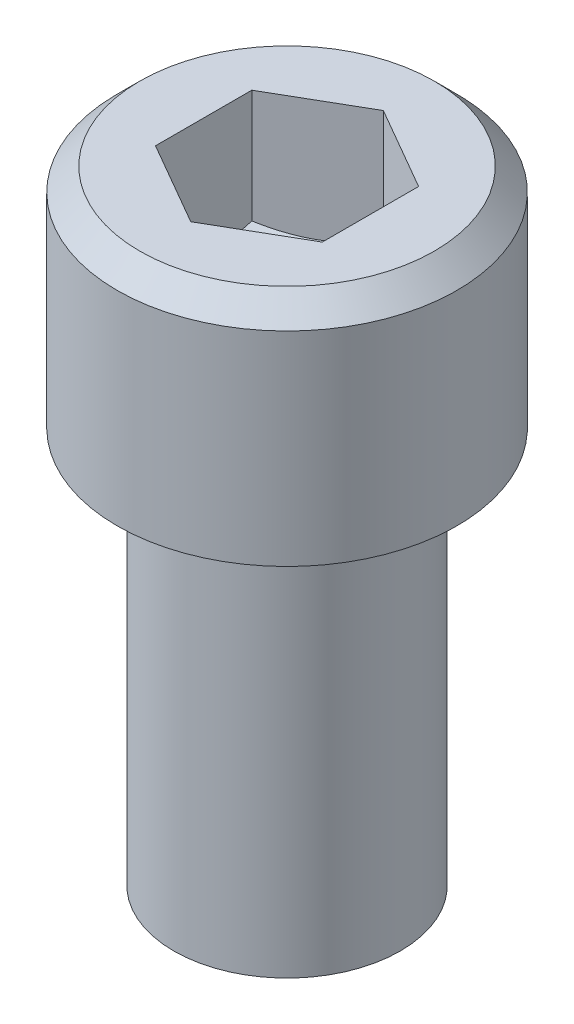
ISO-10303-21;
HEADER;
FILE_DESCRIPTION(('STEP AP214'),'2;1');
FILE_NAME('part.step','',(''),(''),'','','');
FILE_SCHEMA(('AUTOMOTIVE_DESIGN { 1 0 10303 214 1 1 1 1 }'));
ENDSEC;
DATA;
#1=APPLICATION_CONTEXT('core data for automotive mechanical design processes');
#2=APPLICATION_PROTOCOL_DEFINITION('international standard','automotive_design',2000,#1);
#3=PRODUCT_CONTEXT('',#1,'mechanical');
#4=PRODUCT('Part','Part','',(#3));
#5=PRODUCT_RELATED_PRODUCT_CATEGORY('part','',(#4));
#6=PRODUCT_DEFINITION_FORMATION('','',#4);
#7=PRODUCT_DEFINITION_CONTEXT('part definition',#1,'design');
#8=PRODUCT_DEFINITION('design','',#6,#7);
#9=PRODUCT_DEFINITION_SHAPE('','',#8);
#10=(LENGTH_UNIT() NAMED_UNIT(*) SI_UNIT(.MILLI.,.METRE.));
#11=(NAMED_UNIT(*) PLANE_ANGLE_UNIT() SI_UNIT($,.RADIAN.));
#12=(NAMED_UNIT(*) SI_UNIT($,.STERADIAN.) SOLID_ANGLE_UNIT());
#13=UNCERTAINTY_MEASURE_WITH_UNIT(LENGTH_MEASURE(1.E-05),#10,'distance_accuracy_value','');
#14=(GEOMETRIC_REPRESENTATION_CONTEXT(3) GLOBAL_UNCERTAINTY_ASSIGNED_CONTEXT((#13)) GLOBAL_UNIT_ASSIGNED_CONTEXT((#10,
#11,#12)) REPRESENTATION_CONTEXT('',''));
#15=CARTESIAN_POINT('',(0.,0.,0.));
#16=DIRECTION('',(0.,0.,1.));
#17=DIRECTION('',(1.,0.,0.));
#18=AXIS2_PLACEMENT_3D('',#15,#16,#17);
#19=CARTESIAN_POINT('',(0.,0.,0.));
#20=DIRECTION('',(0.,1.,0.));
#21=DIRECTION('',(0.,0.,1.));
#22=AXIS2_PLACEMENT_3D('',#19,#20,#21);
#23=PLANE('',#22);
#24=CARTESIAN_POINT('',(0.,0.,0.));
#25=DIRECTION('',(0.,1.,0.));
#26=DIRECTION('',(0.,0.,1.));
#27=AXIS2_PLACEMENT_3D('',#24,#25,#26);
#28=CIRCLE('',#27,15.);
#29=CARTESIAN_POINT('',(0.,0.,15.));
#30=VERTEX_POINT('',#29);
#31=EDGE_CURVE('E193',#30,#30,#28,.T.);
#32=ORIENTED_EDGE('',*,*,#31,.F.);
#33=EDGE_LOOP('',(#32));
#34=FACE_BOUND('',#33,.T.);
#35=CARTESIAN_POINT('',(0.,0.,0.));
#36=DIRECTION('',(0.,1.,0.));
#37=DIRECTION('',(0.,0.,1.));
#38=AXIS2_PLACEMENT_3D('',#35,#36,#37);
#39=CIRCLE('',#38,10.);
#40=CARTESIAN_POINT('',(0.,0.,10.));
#41=VERTEX_POINT('',#40);
#42=EDGE_CURVE('E11',#41,#41,#39,.F.);
#43=ORIENTED_EDGE('',*,*,#42,.F.);
#44=EDGE_LOOP('',(#43));
#45=FACE_BOUND('',#44,.T.);
#46=ADVANCED_FACE('F33',(#34,#45),#23,.F.);
#47=CARTESIAN_POINT('',(0.,20.,0.));
#48=DIRECTION('',(0.,1.,0.));
#49=DIRECTION('',(0.,0.,1.));
#50=AXIS2_PLACEMENT_3D('',#47,#48,#49);
#51=PLANE('',#50);
#52=CARTESIAN_POINT('',(0.,20.,0.));
#53=DIRECTION('',(0.,1.,0.));
#54=DIRECTION('',(0.,0.,1.));
#55=AXIS2_PLACEMENT_3D('',#52,#53,#54);
#56=CIRCLE('',#55,13.);
#57=CARTESIAN_POINT('',(0.,20.,13.));
#58=VERTEX_POINT('',#57);
#59=EDGE_CURVE('E106',#58,#58,#56,.T.);
#60=ORIENTED_EDGE('',*,*,#59,.T.);
#61=EDGE_LOOP('',(#60));
#62=FACE_BOUND('',#61,.T.);
#63=DIRECTION('',(-0.866025403784439,0.,0.5));
#64=VECTOR('',#63,1.);
#65=CARTESIAN_POINT('',(0.,20.,-8.5));
#66=LINE('',#65,#64);
#67=CARTESIAN_POINT('',(0.,20.,-8.5));
#68=VERTEX_POINT('',#67);
#69=CARTESIAN_POINT('',(-7.36121593216773,20.,-4.25));
#70=VERTEX_POINT('',#69);
#71=EDGE_CURVE('E169',#68,#70,#66,.T.);
#72=ORIENTED_EDGE('',*,*,#71,.F.);
#73=DIRECTION('',(-0.866025403784439,0.,-0.5));
#74=VECTOR('',#73,1.);
#75=CARTESIAN_POINT('',(7.36121593216773,20.,-4.25));
#76=LINE('',#75,#74);
#77=CARTESIAN_POINT('',(7.36121593216773,20.,-4.25));
#78=VERTEX_POINT('',#77);
#79=EDGE_CURVE('E167',#78,#68,#76,.T.);
#80=ORIENTED_EDGE('',*,*,#79,.F.);
#81=DIRECTION('',(0.,0.,-1.));
#82=VECTOR('',#81,1.);
#83=CARTESIAN_POINT('',(7.36121593216773,20.,4.25));
#84=LINE('',#83,#82);
#85=CARTESIAN_POINT('',(7.36121593216773,20.,4.25));
#86=VERTEX_POINT('',#85);
#87=EDGE_CURVE('E178',#86,#78,#84,.T.);
#88=ORIENTED_EDGE('',*,*,#87,.F.);
#89=DIRECTION('',(0.866025403784439,0.,-0.5));
#90=VECTOR('',#89,1.);
#91=CARTESIAN_POINT('',(0.,20.,8.5));
#92=LINE('',#91,#90);
#93=CARTESIAN_POINT('',(0.,20.,8.5));
#94=VERTEX_POINT('',#93);
#95=EDGE_CURVE('E175',#94,#86,#92,.T.);
#96=ORIENTED_EDGE('',*,*,#95,.F.);
#97=DIRECTION('',(0.866025403784439,0.,0.5));
#98=VECTOR('',#97,1.);
#99=CARTESIAN_POINT('',(-7.36121593216773,20.,4.25));
#100=LINE('',#99,#98);
#101=CARTESIAN_POINT('',(-7.36121593216773,20.,4.25));
#102=VERTEX_POINT('',#101);
#103=EDGE_CURVE('E173',#102,#94,#100,.T.);
#104=ORIENTED_EDGE('',*,*,#103,.F.);
#105=DIRECTION('',(0.,0.,1.));
#106=VECTOR('',#105,1.);
#107=CARTESIAN_POINT('',(-7.36121593216773,20.,-4.25));
#108=LINE('',#107,#106);
#109=EDGE_CURVE('E171',#70,#102,#108,.T.);
#110=ORIENTED_EDGE('',*,*,#109,.F.);
#111=EDGE_LOOP('',(#72,#80,#88,#96,#104,#110));
#112=FACE_BOUND('',#111,.T.);
#113=ADVANCED_FACE('F161',(#62,#112),#51,.T.);
#114=CARTESIAN_POINT('',(0.,20.,0.));
#115=DIRECTION('',(0.,-1.,0.));
#116=DIRECTION('',(0.,0.,-1.));
#117=AXIS2_PLACEMENT_3D('',#114,#115,#116);
#118=CYLINDRICAL_SURFACE('',#117,15.);
#119=CARTESIAN_POINT('',(0.,18.,0.));
#120=DIRECTION('',(0.,1.,0.));
#121=DIRECTION('',(0.,0.,1.));
#122=AXIS2_PLACEMENT_3D('',#119,#120,#121);
#123=CIRCLE('',#122,15.);
#124=CARTESIAN_POINT('',(0.,18.,15.));
#125=VERTEX_POINT('',#124);
#126=EDGE_CURVE('E104',#125,#125,#123,.F.);
#127=ORIENTED_EDGE('',*,*,#126,.T.);
#128=EDGE_LOOP('',(#127));
#129=FACE_BOUND('',#128,.T.);
#130=ORIENTED_EDGE('',*,*,#31,.T.);
#131=EDGE_LOOP('',(#130));
#132=FACE_BOUND('',#131,.T.);
#133=ADVANCED_FACE('F159',(#129,#132),#118,.T.);
#134=CARTESIAN_POINT('',(7.36121593216773,20.,-4.25));
#135=DIRECTION('',(-0.5,0.,0.866025403784439));
#136=DIRECTION('',(0.866025403784439,0.,0.5));
#137=AXIS2_PLACEMENT_3D('',#134,#135,#136);
#138=PLANE('',#137);
#139=CARTESIAN_POINT('',(7.36141593216773,10.0000666680251,-4.24988452994616));
#140=CARTESIAN_POINT('',(7.19960818175587,9.94613895952467,-4.34330427820342));
#141=CARTESIAN_POINT('',(7.03719713388849,9.89465870137131,-4.43707234040902));
#142=CARTESIAN_POINT('',(6.7110560874949,9.79726716089987,-4.62536996133815));
#143=CARTESIAN_POINT('',(6.54732555222756,9.75135828096166,-4.71989982994931));
#144=CARTESIAN_POINT('',(6.05351243049603,9.62288983377227,-5.00500296871037));
#145=CARTESIAN_POINT('',(5.72148060044795,9.54981848380212,-5.19670163516816));
#146=CARTESIAN_POINT('',(5.22460101081872,9.46413377999269,-5.48357519999542));
#147=CARTESIAN_POINT('',(5.06123786339596,9.43972470107806,-5.57789295713562));
#148=CARTESIAN_POINT('',(4.73377342364453,9.39879426611522,-5.76695463957614));
#149=CARTESIAN_POINT('',(4.56967219782834,9.38227221314881,-5.86169852647546));
#150=CARTESIAN_POINT('',(4.24118474388598,9.35753689940043,-6.0513508464345));
#151=CARTESIAN_POINT('',(4.07679905224546,9.34931420919841,-6.14625896975407));
#152=CARTESIAN_POINT('',(3.74788490137995,9.34134511518765,-6.33615764329655));
#153=CARTESIAN_POINT('',(3.58335644672258,9.34159844951695,-6.43114819088234));
#154=CARTESIAN_POINT('',(3.13260428390249,9.3539432482886,-6.69139007342433));
#155=CARTESIAN_POINT('',(2.84652813349521,9.37466619161034,-6.8565562158707));
#156=CARTESIAN_POINT('',(2.2762759224993,9.44037826228818,-7.18579148339516));
#157=CARTESIAN_POINT('',(1.9921018673287,9.48538984865689,-7.34985945064462));
#158=CARTESIAN_POINT('',(1.4207020681992,9.59790553348465,-7.67975727848693));
#159=CARTESIAN_POINT('',(1.13354842244687,9.66588633917057,-7.84554551316082));
#160=CARTESIAN_POINT('',(0.563523350558411,9.82017525452583,-8.17464964186046));
#161=CARTESIAN_POINT('',(0.280644624544245,9.90644712344439,-8.33796975047276));
#162=CARTESIAN_POINT('',(-0.000200000000001161,10.0000666680251,-8.50011547005384));
#163=B_SPLINE_CURVE_WITH_KNOTS('',3,(#139,#140,#141,#142,#143,#144,#145,#146,#147,#148,#149,
#150,#151,#152,#153,#154,#155,#156,#157,#158,#159,#160,#161,#162),.UNSPECIFIED.,.F.,.F.,(4,2,2,
2,2,2,2,2,2,2,2,4),(0.,0.583352725260263,1.16695610529089,2.33658787289725,2.90707928832208,
3.47752028430155,4.0473124348964,4.61708698210426,5.60899117781515,6.60181413455886,
7.61665629949857,8.62950620385062),.UNSPECIFIED.);
#164=CARTESIAN_POINT('',(7.36121593216773,10.,-4.25));
#165=VERTEX_POINT('',#164);
#166=CARTESIAN_POINT('',(0.,10.,-8.5));
#167=VERTEX_POINT('',#166);
#168=EDGE_CURVE('E99',#165,#167,#163,.T.);
#169=ORIENTED_EDGE('',*,*,#168,.F.);
#170=DIRECTION('',(0.,-1.,0.));
#171=VECTOR('',#170,1.);
#172=CARTESIAN_POINT('',(7.36121593216773,20.,-4.25));
#173=LINE('',#172,#171);
#174=EDGE_CURVE('E180',#78,#165,#173,.T.);
#175=ORIENTED_EDGE('',*,*,#174,.F.);
#176=ORIENTED_EDGE('',*,*,#79,.T.);
#177=DIRECTION('',(0.,-1.,0.));
#178=VECTOR('',#177,1.);
#179=CARTESIAN_POINT('',(0.,20.,-8.5));
#180=LINE('',#179,#178);
#181=EDGE_CURVE('E191',#68,#167,#180,.T.);
#182=ORIENTED_EDGE('',*,*,#181,.T.);
#183=EDGE_LOOP('',(#169,#175,#176,#182));
#184=FACE_BOUND('',#183,.T.);
#185=ADVANCED_FACE('F155',(#184),#138,.T.);
#186=CARTESIAN_POINT('',(0.,20.,-8.5));
#187=DIRECTION('',(0.5,0.,0.866025403784439));
#188=DIRECTION('',(0.866025403784439,0.,-0.5));
#189=AXIS2_PLACEMENT_3D('',#186,#187,#188);
#190=PLANE('',#189);
#191=CARTESIAN_POINT('',(0.000199999999999696,10.0000666680251,-8.50011547005384));
#192=CARTESIAN_POINT('',(-0.161607750411857,9.94613895952467,-8.40669572179659));
#193=CARTESIAN_POINT('',(-0.32401879827924,9.89465870137131,-8.31292765959098));
#194=CARTESIAN_POINT('',(-0.650159844672832,9.79726716089987,-8.12463003866186));
#195=CARTESIAN_POINT('',(-0.813890379940173,9.75135828096166,-8.0301001700507));
#196=CARTESIAN_POINT('',(-1.3077035016717,9.62288983377227,-7.74499703128963));
#197=CARTESIAN_POINT('',(-1.63973533171978,9.54981848380212,-7.55329836483185));
#198=CARTESIAN_POINT('',(-2.13661492134901,9.46413377999269,-7.26642480000458));
#199=CARTESIAN_POINT('',(-2.29997806877177,9.43972470107806,-7.17210704286438));
#200=CARTESIAN_POINT('',(-2.6274425085232,9.39879426611522,-6.98304536042386));
#201=CARTESIAN_POINT('',(-2.79154373433938,9.38227221314881,-6.88830147352454));
#202=CARTESIAN_POINT('',(-3.12003118828175,9.35753689940043,-6.6986491535655));
#203=CARTESIAN_POINT('',(-3.28441687992227,9.34931420919841,-6.60374103024593));
#204=CARTESIAN_POINT('',(-3.61333103078778,9.34134511518765,-6.41384235670345));
#205=CARTESIAN_POINT('',(-3.77785948544515,9.34159844951695,-6.31885180911766));
#206=CARTESIAN_POINT('',(-4.22861164826524,9.3539432482886,-6.05860992657568));
#207=CARTESIAN_POINT('',(-4.51468779867251,9.37466619161034,-5.89344378412931));
#208=CARTESIAN_POINT('',(-5.08494000966843,9.44037826228818,-5.56420851660484));
#209=CARTESIAN_POINT('',(-5.36911406483903,9.48538984865689,-5.40014054935538));
#210=CARTESIAN_POINT('',(-5.94051386396853,9.59790553348465,-5.07024272151307));
#211=CARTESIAN_POINT('',(-6.22766750972086,9.66588633917057,-4.90445448683918));
#212=CARTESIAN_POINT('',(-6.79769258160932,9.82017525452583,-4.57535035813954));
#213=CARTESIAN_POINT('',(-7.08057130762348,9.90644712344439,-4.41203024952724));
#214=CARTESIAN_POINT('',(-7.36141593216773,10.0000666680251,-4.24988452994616));
#215=B_SPLINE_CURVE_WITH_KNOTS('',3,(#191,#192,#193,#194,#195,#196,#197,#198,#199,#200,#201,
#202,#203,#204,#205,#206,#207,#208,#209,#210,#211,#212,#213,#214),.UNSPECIFIED.,.F.,.F.,(4,2,2,
2,2,2,2,2,2,2,2,4),(0.,0.583352725260262,1.16695610529089,2.33658787289725,2.90707928832208,
3.47752028430155,4.0473124348964,4.61708698210426,5.60899117781515,6.60181413455886,
7.61665629949857,8.62950620385062),.UNSPECIFIED.);
#216=CARTESIAN_POINT('',(-7.36121593216773,10.,-4.25));
#217=VERTEX_POINT('',#216);
#218=EDGE_CURVE('E48',#167,#217,#215,.T.);
#219=ORIENTED_EDGE('',*,*,#218,.F.);
#220=ORIENTED_EDGE('',*,*,#181,.F.);
#221=ORIENTED_EDGE('',*,*,#71,.T.);
#222=DIRECTION('',(0.,-1.,0.));
#223=VECTOR('',#222,1.);
#224=CARTESIAN_POINT('',(-7.36121593216773,20.,-4.25));
#225=LINE('',#224,#223);
#226=EDGE_CURVE('E189',#70,#217,#225,.T.);
#227=ORIENTED_EDGE('',*,*,#226,.T.);
#228=EDGE_LOOP('',(#219,#220,#221,#227));
#229=FACE_BOUND('',#228,.T.);
#230=ADVANCED_FACE('F151',(#229),#190,.T.);
#231=CARTESIAN_POINT('',(-7.36121593216773,20.,-4.25));
#232=DIRECTION('',(1.,0.,0.));
#233=DIRECTION('',(0.,0.,-1.));
#234=AXIS2_PLACEMENT_3D('',#231,#232,#233);
#235=PLANE('',#234);
#236=CARTESIAN_POINT('',(-7.36121593216773,12.7371598535109,-11.0060860927594));
#237=CARTESIAN_POINT('',(-7.36121593216773,12.5846517830262,-10.6882034280636));
#238=CARTESIAN_POINT('',(-7.36121593216773,12.4337277821218,-10.3695463655895));
#239=CARTESIAN_POINT('',(-7.36121593216773,12.1359465436057,-9.73027070249291));
#240=CARTESIAN_POINT('',(-7.36121593216773,11.9890900377323,-9.40965176143511));
#241=CARTESIAN_POINT('',(-7.36121593216773,11.6995219860401,-8.76420124102433));
#242=CARTESIAN_POINT('',(-7.36121593216773,11.5568409875494,-8.43935590540438));
#243=CARTESIAN_POINT('',(-7.36121593216773,11.27787714956,-7.78693939772008));
#244=CARTESIAN_POINT('',(-7.36121593216773,11.1415939775906,-7.45936836834347));
#245=CARTESIAN_POINT('',(-7.36121593216773,10.8736591831411,-6.79235029959029));
#246=CARTESIAN_POINT('',(-7.36121593216773,10.742221818657,-6.4528166804155));
#247=CARTESIAN_POINT('',(-7.36121593216773,10.4902747786098,-5.76964347702385));
#248=CARTESIAN_POINT('',(-7.36121593216773,10.3697663695335,-5.42600342214731));
#249=CARTESIAN_POINT('',(-7.36121593216773,10.1431190263413,-4.73484477176889));
#250=CARTESIAN_POINT('',(-7.36121593216773,10.03694746816,-4.38733699853979));
#251=CARTESIAN_POINT('',(-7.36121593216773,9.84261749280186,-3.68738449506551));
#252=CARTESIAN_POINT('',(-7.36121593216773,9.75445302146668,-3.33494146682685));
#253=CARTESIAN_POINT('',(-7.36121593216773,9.60083056620083,-2.62574688108735));
#254=CARTESIAN_POINT('',(-7.36121593216773,9.53532692802668,-2.26900550261343));
#255=CARTESIAN_POINT('',(-7.36121593216773,9.45729002570221,-1.73098289849675));
#256=CARTESIAN_POINT('',(-7.36121593216773,9.43464637180266,-1.55114084836175));
#257=CARTESIAN_POINT('',(-7.36121593216773,9.39654857590444,-1.19070246894475));
#258=CARTESIAN_POINT('',(-7.36121593216773,9.38109375540148,-1.01010621247111));
#259=CARTESIAN_POINT('',(-7.36121593216773,9.35785661505417,-0.650578586619515));
#260=CARTESIAN_POINT('',(-7.36121593216773,9.34998513713767,-0.471652995143195));
#261=CARTESIAN_POINT('',(-7.36121593216773,9.34177442851608,-0.113630248199395));
#262=CARTESIAN_POINT('',(-7.36121593216773,9.34143508513,0.0654669046614378));
#263=CARTESIAN_POINT('',(-7.36121593216773,9.34829749090963,0.423522536669169));
#264=CARTESIAN_POINT('',(-7.36121593216773,9.3554994909768,0.602481011003973));
#265=CARTESIAN_POINT('',(-7.36121593216773,9.37727848245017,0.959951458975741));
#266=CARTESIAN_POINT('',(-7.36121593216773,9.39185588580012,1.13846340711282));
#267=CARTESIAN_POINT('',(-7.36121593216773,9.43672824002924,1.57985478595483));
#268=CARTESIAN_POINT('',(-7.36121593216773,9.47120462808069,1.84231558142463));
#269=CARTESIAN_POINT('',(-7.36121593216773,9.55412187585899,2.36502428556028));
#270=CARTESIAN_POINT('',(-7.36121593216773,9.60256497816221,2.62527183194002));
#271=CARTESIAN_POINT('',(-7.36121593216773,9.71169176289983,3.14339334369931));
#272=CARTESIAN_POINT('',(-7.36121593216773,9.77238577140595,3.40126511355961));
#273=CARTESIAN_POINT('',(-7.36121593216773,9.90419106439866,3.91430086834253));
#274=CARTESIAN_POINT('',(-7.36121593216773,9.97530209385418,4.16946491939195));
#275=CARTESIAN_POINT('',(-7.36121593216773,10.1279707859107,4.68286426301545));
#276=CARTESIAN_POINT('',(-7.36121593216773,10.2097269328074,4.94104013545649));
#277=CARTESIAN_POINT('',(-7.36121593216773,10.3808377219459,5.45484806131504));
#278=CARTESIAN_POINT('',(-7.36121593216773,10.4701924187331,5.71048009645721));
#279=CARTESIAN_POINT('',(-7.36121593216773,10.6551564928607,6.2193447708992));
#280=CARTESIAN_POINT('',(-7.36121593216773,10.7507633418746,6.47257833327323));
#281=CARTESIAN_POINT('',(-7.36121593216773,10.9471909395647,6.97700199843276));
#282=CARTESIAN_POINT('',(-7.36121593216773,11.0480116022434,7.22819213484377));
#283=CARTESIAN_POINT('',(-7.36121593216773,11.3118303695482,7.86938611194774));
#284=CARTESIAN_POINT('',(-7.36121593216773,11.4779431421433,8.25810718157448));
#285=CARTESIAN_POINT('',(-7.36121593216773,11.8181592959437,9.0320474760509));
#286=CARTESIAN_POINT('',(-7.36121593216773,11.9922632792978,9.41726643438278));
#287=CARTESIAN_POINT('',(-7.36121593216773,12.3466657505692,10.1849595462372));
#288=CARTESIAN_POINT('',(-7.36121593216772,12.5269658586937,10.5674329497361));
#289=CARTESIAN_POINT('',(-7.36121593216772,12.8923641012256,11.3300617925132));
#290=CARTESIAN_POINT('',(-7.36121593216772,13.0774621046556,11.7102172947185));
#291=CARTESIAN_POINT('',(-7.36121593216772,13.4516911109892,12.4691040054739));
#292=CARTESIAN_POINT('',(-7.36121593216772,13.6408267029194,12.8478329470405));
#293=CARTESIAN_POINT('',(-7.36121593216772,14.0221657852851,13.6037435799026));
#294=CARTESIAN_POINT('',(-7.36121593216772,14.2143692928253,13.9809252625567));
#295=CARTESIAN_POINT('',(-7.36121593216772,14.6012419210547,14.7339479738573));
#296=CARTESIAN_POINT('',(-7.36121593216772,14.7959106611148,15.1097891982561));
#297=CARTESIAN_POINT('',(-7.36121593216772,15.187304765345,15.8603997964074));
#298=CARTESIAN_POINT('',(-7.36121593216772,15.3840301362629,16.2351691666379));
#299=CARTESIAN_POINT('',(-7.36121593216772,15.9394626441247,17.287469091883));
#300=CARTESIAN_POINT('',(-7.36121593216772,16.3001104773351,17.9639751578056));
#301=CARTESIAN_POINT('',(-7.36121593216772,17.0255079271171,19.3148171188177));
#302=CARTESIAN_POINT('',(-7.36121593216772,17.3902577176417,19.9891529203005));
#303=CARTESIAN_POINT('',(-7.36121593216772,18.1219066318219,21.3344342721722));
#304=CARTESIAN_POINT('',(-7.36121593216772,18.4887979288144,22.0053840831206));
#305=CARTESIAN_POINT('',(-7.36121593216772,19.2249664765955,23.3459235766608));
#306=CARTESIAN_POINT('',(-7.36121593216772,19.5942435884088,24.0155133355428));
#307=CARTESIAN_POINT('',(-7.36121593216772,19.964395148617,24.6846160456873));
#308=B_SPLINE_CURVE_WITH_KNOTS('',3,(#236,#237,#238,#239,#240,#241,#242,#243,#244,#245,#246,
#247,#248,#249,#250,#251,#252,#253,#254,#255,#256,#257,#258,#259,#260,#261,#262,#263,#264,#265,
#266,#267,#268,#269,#270,#271,#272,#273,#274,#275,#276,#277,#278,#279,#280,#281,#282,#283,#284,
#285,#286,#287,#288,#289,#290,#291,#292,#293,#294,#295,#296,#297,#298,#299,#300,#301,#302,#303,
#304,#305,#306,#307),.UNSPECIFIED.,.F.,.F.,(4,2,2,2,2,2,2,2,2,2,2,2,2,2,2,2,2,2,2,2,2,2,2,2,2,2,
2,2,2,2,2,2,2,2,2,4),(0.,1.0577356376546,2.11566034100395,3.18000245417199,4.24428919615383,
5.3364024635684,6.42864212772349,7.51835289624393,8.60769668808471,9.69483284616079,
10.238497449304,10.7821107292859,11.3192517462844,11.8563847276297,12.3935355800267,
12.9307164376123,13.7244153039608,14.5182416822291,15.3127399779307,16.1072188258564,
16.9195115528273,17.7318101112404,18.5437821892325,19.3557408787185,20.6237892796655,
21.8919333871759,23.1604116597279,24.428855340555,25.6988267991184,26.9688053408026,
28.2385901337958,29.5083790942402,31.8082586568396,34.1082361217754,36.4023635222985,
38.6963584719053),.UNSPECIFIED.);
#309=CARTESIAN_POINT('',(-7.36121593216773,10.,4.25));
#310=VERTEX_POINT('',#309);
#311=EDGE_CURVE('E56',#217,#310,#308,.T.);
#312=ORIENTED_EDGE('',*,*,#311,.F.);
#313=ORIENTED_EDGE('',*,*,#226,.F.);
#314=ORIENTED_EDGE('',*,*,#109,.T.);
#315=DIRECTION('',(0.,-1.,0.));
#316=VECTOR('',#315,1.);
#317=CARTESIAN_POINT('',(-7.36121593216773,20.,4.25));
#318=LINE('',#317,#316);
#319=EDGE_CURVE('E187',#102,#310,#318,.T.);
#320=ORIENTED_EDGE('',*,*,#319,.T.);
#321=EDGE_LOOP('',(#312,#313,#314,#320));
#322=FACE_BOUND('',#321,.T.);
#323=ADVANCED_FACE('F148',(#322),#235,.T.);
#324=CARTESIAN_POINT('',(-7.36121593216773,20.,4.25));
#325=DIRECTION('',(0.5,0.,-0.866025403784439));
#326=DIRECTION('',(-0.866025403784439,0.,-0.5));
#327=AXIS2_PLACEMENT_3D('',#324,#325,#326);
#328=PLANE('',#327);
#329=CARTESIAN_POINT('',(-7.36141593216773,10.0000666680251,4.24988452994616));
#330=CARTESIAN_POINT('',(-7.19960818175587,9.94613895952467,4.34330427820342));
#331=CARTESIAN_POINT('',(-7.03719713388849,9.8946587013713,4.43707234040902));
#332=CARTESIAN_POINT('',(-6.71105608749489,9.79726716089987,4.62536996133815));
#333=CARTESIAN_POINT('',(-6.54732555222755,9.75135828096166,4.71989982994931));
#334=CARTESIAN_POINT('',(-6.05351243049602,9.62288983377227,5.00500296871037));
#335=CARTESIAN_POINT('',(-5.72148060044795,9.54981848380212,5.19670163516816));
#336=CARTESIAN_POINT('',(-5.22460101081872,9.46413377999269,5.48357519999542));
#337=CARTESIAN_POINT('',(-5.06123786339596,9.43972470107806,5.57789295713562));
#338=CARTESIAN_POINT('',(-4.73377342364452,9.39879426611521,5.76695463957614));
#339=CARTESIAN_POINT('',(-4.56967219782834,9.38227221314881,5.86169852647546));
#340=CARTESIAN_POINT('',(-4.24118474388598,9.35753689940043,6.0513508464345));
#341=CARTESIAN_POINT('',(-4.07679905224546,9.34931420919841,6.14625896975407));
#342=CARTESIAN_POINT('',(-3.74788490137995,9.34134511518765,6.33615764329655));
#343=CARTESIAN_POINT('',(-3.58335644672258,9.34159844951695,6.43114819088234));
#344=CARTESIAN_POINT('',(-3.13260428390249,9.3539432482886,6.69139007342433));
#345=CARTESIAN_POINT('',(-2.84652813349521,9.37466619161034,6.8565562158707));
#346=CARTESIAN_POINT('',(-2.2762759224993,9.44037826228818,7.18579148339516));
#347=CARTESIAN_POINT('',(-1.9921018673287,9.48538984865689,7.34985945064462));
#348=CARTESIAN_POINT('',(-1.4207020681992,9.59790553348465,7.67975727848693));
#349=CARTESIAN_POINT('',(-1.13354842244687,9.66588633917057,7.84554551316082));
#350=CARTESIAN_POINT('',(-0.563523350558411,9.82017525452583,8.17464964186046));
#351=CARTESIAN_POINT('',(-0.280644624544245,9.90644712344439,8.33796975047276));
#352=CARTESIAN_POINT('',(0.000200000000001375,10.0000666680251,8.50011547005384));
#353=B_SPLINE_CURVE_WITH_KNOTS('',3,(#329,#330,#331,#332,#333,#334,#335,#336,#337,#338,#339,
#340,#341,#342,#343,#344,#345,#346,#347,#348,#349,#350,#351,#352),.UNSPECIFIED.,.F.,.F.,(4,2,2,
2,2,2,2,2,2,2,2,4),(0.,0.583352725260264,1.16695610529089,2.33658787289725,2.90707928832208,
3.47752028430155,4.0473124348964,4.61708698210426,5.60899117781515,6.60181413455886,
7.61665629949857,8.62950620385062),.UNSPECIFIED.);
#354=CARTESIAN_POINT('',(0.,10.,8.5));
#355=VERTEX_POINT('',#354);
#356=EDGE_CURVE('E133',#310,#355,#353,.T.);
#357=ORIENTED_EDGE('',*,*,#356,.F.);
#358=ORIENTED_EDGE('',*,*,#319,.F.);
#359=ORIENTED_EDGE('',*,*,#103,.T.);
#360=DIRECTION('',(0.,-1.,0.));
#361=VECTOR('',#360,1.);
#362=CARTESIAN_POINT('',(0.,20.,8.5));
#363=LINE('',#362,#361);
#364=EDGE_CURVE('E184',#94,#355,#363,.T.);
#365=ORIENTED_EDGE('',*,*,#364,.T.);
#366=EDGE_LOOP('',(#357,#358,#359,#365));
#367=FACE_BOUND('',#366,.T.);
#368=ADVANCED_FACE('F123',(#367),#328,.T.);
#369=CARTESIAN_POINT('',(0.,20.,8.5));
#370=DIRECTION('',(-0.5,0.,-0.866025403784439));
#371=DIRECTION('',(-0.866025403784439,0.,0.5));
#372=AXIS2_PLACEMENT_3D('',#369,#370,#371);
#373=PLANE('',#372);
#374=CARTESIAN_POINT('',(-0.000200000000000077,10.0000666680251,8.50011547005384));
#375=CARTESIAN_POINT('',(0.161607750411857,9.94613895952467,8.40669572179659));
#376=CARTESIAN_POINT('',(0.32401879827924,9.89465870137131,8.31292765959098));
#377=CARTESIAN_POINT('',(0.650159844672831,9.79726716089987,8.12463003866186));
#378=CARTESIAN_POINT('',(0.813890379940172,9.75135828096166,8.0301001700507));
#379=CARTESIAN_POINT('',(1.3077035016717,9.62288983377227,7.74499703128963));
#380=CARTESIAN_POINT('',(1.63973533171978,9.54981848380212,7.55329836483185));
#381=CARTESIAN_POINT('',(2.13661492134901,9.46413377999269,7.26642480000458));
#382=CARTESIAN_POINT('',(2.29997806877177,9.43972470107806,7.17210704286438));
#383=CARTESIAN_POINT('',(2.6274425085232,9.39879426611522,6.98304536042386));
#384=CARTESIAN_POINT('',(2.79154373433938,9.38227221314881,6.88830147352454));
#385=CARTESIAN_POINT('',(3.12003118828175,9.35753689940043,6.6986491535655));
#386=CARTESIAN_POINT('',(3.28441687992227,9.34931420919841,6.60374103024593));
#387=CARTESIAN_POINT('',(3.61333103078778,9.34134511518765,6.41384235670345));
#388=CARTESIAN_POINT('',(3.77785948544515,9.34159844951695,6.31885180911766));
#389=CARTESIAN_POINT('',(4.22861164826524,9.3539432482886,6.05860992657568));
#390=CARTESIAN_POINT('',(4.51468779867251,9.37466619161034,5.89344378412931));
#391=CARTESIAN_POINT('',(5.08494000966843,9.44037826228818,5.56420851660484));
#392=CARTESIAN_POINT('',(5.36911406483903,9.48538984865689,5.40014054935538));
#393=CARTESIAN_POINT('',(5.94051386396853,9.59790553348465,5.07024272151307));
#394=CARTESIAN_POINT('',(6.22766750972086,9.66588633917057,4.90445448683918));
#395=CARTESIAN_POINT('',(6.79769258160932,9.82017525452583,4.57535035813954));
#396=CARTESIAN_POINT('',(7.08057130762348,9.90644712344439,4.41203024952724));
#397=CARTESIAN_POINT('',(7.36141593216773,10.0000666680251,4.24988452994616));
#398=B_SPLINE_CURVE_WITH_KNOTS('',3,(#374,#375,#376,#377,#378,#379,#380,#381,#382,#383,#384,
#385,#386,#387,#388,#389,#390,#391,#392,#393,#394,#395,#396,#397),.UNSPECIFIED.,.F.,.F.,(4,2,2,
2,2,2,2,2,2,2,2,4),(0.,0.583352725260262,1.16695610529089,2.33658787289725,2.90707928832208,
3.47752028430155,4.0473124348964,4.61708698210426,5.60899117781515,6.60181413455886,
7.61665629949858,8.62950620385062),.UNSPECIFIED.);
#399=CARTESIAN_POINT('',(7.36121593216773,10.,4.25));
#400=VERTEX_POINT('',#399);
#401=EDGE_CURVE('E101',#355,#400,#398,.T.);
#402=ORIENTED_EDGE('',*,*,#401,.F.);
#403=ORIENTED_EDGE('',*,*,#364,.F.);
#404=ORIENTED_EDGE('',*,*,#95,.T.);
#405=DIRECTION('',(0.,-1.,0.));
#406=VECTOR('',#405,1.);
#407=CARTESIAN_POINT('',(7.36121593216773,20.,4.25));
#408=LINE('',#407,#406);
#409=EDGE_CURVE('E182',#86,#400,#408,.T.);
#410=ORIENTED_EDGE('',*,*,#409,.T.);
#411=EDGE_LOOP('',(#402,#403,#404,#410));
#412=FACE_BOUND('',#411,.T.);
#413=ADVANCED_FACE('F119',(#412),#373,.T.);
#414=CARTESIAN_POINT('',(7.36121593216773,20.,4.25));
#415=DIRECTION('',(-1.,0.,0.));
#416=DIRECTION('',(0.,0.,1.));
#417=AXIS2_PLACEMENT_3D('',#414,#415,#416);
#418=PLANE('',#417);
#419=CARTESIAN_POINT('',(7.36121593216773,12.7371598516111,-11.0060860888009));
#420=CARTESIAN_POINT('',(7.36121593216773,12.5846517812083,-10.6882034242403));
#421=CARTESIAN_POINT('',(7.36121593216773,12.4337277803857,-10.3695463619015));
#422=CARTESIAN_POINT('',(7.36121593216773,12.1359465420327,-9.73027069907626));
#423=CARTESIAN_POINT('',(7.36121593216773,11.9890900362406,-9.40965175815434));
#424=CARTESIAN_POINT('',(7.36121593216773,11.6995219847113,-8.76420123801791));
#425=CARTESIAN_POINT('',(7.36121593216773,11.5568409863019,-8.43935590253643));
#426=CARTESIAN_POINT('',(7.36121593216773,11.2778771484738,-7.78693939513018));
#427=CARTESIAN_POINT('',(7.36121593216773,11.1415939765843,-7.45936836589313));
#428=CARTESIAN_POINT('',(7.36121593216773,10.8736591822949,-6.7923502974272));
#429=CARTESIAN_POINT('',(7.36121593216773,10.742221817891,-6.45281667840017));
#430=CARTESIAN_POINT('',(7.36121593216773,10.4902747779993,-5.76964347530666));
#431=CARTESIAN_POINT('',(7.36121593216773,10.3697663689983,-5.42600342058051));
#432=CARTESIAN_POINT('',(7.36121593216773,10.1431190259484,-4.7348447705057));
#433=CARTESIAN_POINT('',(7.36121593216773,10.0369474678342,-4.38733699742981));
#434=CARTESIAN_POINT('',(7.36121593216773,9.84261749259761,-3.68738449426625));
#435=CARTESIAN_POINT('',(7.36121593216773,9.754453021317,-3.3349414661851));
#436=CARTESIAN_POINT('',(7.36121593216773,9.60083056615129,-2.62574688080964));
#437=CARTESIAN_POINT('',(7.36121593216773,9.53532692801997,-2.26900550254287));
#438=CARTESIAN_POINT('',(7.36121593216773,9.45729002573574,-1.73098289874006));
#439=CARTESIAN_POINT('',(7.36121593216773,9.43464637184559,-1.55114084871019));
#440=CARTESIAN_POINT('',(7.36121593216773,9.39654857595747,-1.1907024695041));
#441=CARTESIAN_POINT('',(7.36121593216773,9.3810937554552,-1.01010621313625));
#442=CARTESIAN_POINT('',(7.36121593216773,9.3578566151001,-0.650578587494099));
#443=CARTESIAN_POINT('',(7.36121593216773,9.34998513717525,-0.471652996121429));
#444=CARTESIAN_POINT('',(7.36121593216773,9.3417744285281,-0.113630249384494));
#445=CARTESIAN_POINT('',(7.36121593216773,9.34143508512481,0.0654669033731227));
#446=CARTESIAN_POINT('',(7.36121593216773,9.3482974908615,0.423522535175344));
#447=CARTESIAN_POINT('',(7.36121593216773,9.35549949090295,0.602481009407854));
#448=CARTESIAN_POINT('',(7.36121593216773,9.37727848231714,0.959951457176466));
#449=CARTESIAN_POINT('',(7.36121593216773,9.39185588563362,1.13846340521268));
#450=CARTESIAN_POINT('',(7.36121593216773,9.43672823977989,1.57985478388922));
#451=CARTESIAN_POINT('',(7.36121593216773,9.47120462778278,1.84231557929496));
#452=CARTESIAN_POINT('',(7.36121593216773,9.55412187546127,2.36502428330509));
#453=CARTESIAN_POINT('',(7.36121593216773,9.60256497771324,2.62527182962335));
#454=CARTESIAN_POINT('',(7.36121593216773,9.7116917623474,3.14339334126166));
#455=CARTESIAN_POINT('',(7.36121593216773,9.77238577080133,3.40126511106246));
#456=CARTESIAN_POINT('',(7.36121593216773,9.90419106368996,3.9143008657278));
#457=CARTESIAN_POINT('',(7.36121593216773,9.97530209309361,4.16946491671915));
#458=CARTESIAN_POINT('',(7.36121593216773,10.1279707850459,4.682864260225));
#459=CARTESIAN_POINT('',(7.36121593216773,10.2097269318902,4.94104013260648));
#460=CARTESIAN_POINT('',(7.36121593216773,10.3808377209254,5.45484805834643));
#461=CARTESIAN_POINT('',(7.36121593216773,10.4701924176615,5.71048009342954));
#462=CARTESIAN_POINT('',(7.36121593216773,10.6551564916885,6.21934476775376));
#463=CARTESIAN_POINT('',(7.36121593216773,10.7507633406529,6.47257833006906));
#464=CARTESIAN_POINT('',(7.36121593216773,10.9471909382453,6.97700199511114));
#465=CARTESIAN_POINT('',(7.36121593216773,11.0480116008758,7.22819213146341));
#466=CARTESIAN_POINT('',(7.36121593216773,11.3118303681048,7.86938610852841));
#467=CARTESIAN_POINT('',(7.36121593216773,11.4779431406763,8.2581071781736));
#468=CARTESIAN_POINT('',(7.36121593216773,11.818159294436,9.03204747268461));
#469=CARTESIAN_POINT('',(7.36121593216773,11.992263277773,9.41726643103265));
#470=CARTESIAN_POINT('',(7.36121593216773,12.346665749015,10.1849595429177));
#471=CARTESIAN_POINT('',(7.36121593216773,12.5269658571272,10.567432946431));
#472=CARTESIAN_POINT('',(7.36121593216773,12.8923640996381,11.3300617892356));
#473=CARTESIAN_POINT('',(7.36121593216773,13.0774621030593,11.7102172914539));
#474=CARTESIAN_POINT('',(7.36121593216773,13.4516911093782,12.4691040022347));
#475=CARTESIAN_POINT('',(7.36121593216773,13.6408267013026,12.8478329438138));
#476=CARTESIAN_POINT('',(7.36121593216773,14.0221657836584,13.6037435766999));
#477=CARTESIAN_POINT('',(7.36121593216773,14.2143692911948,13.9809252593655));
#478=CARTESIAN_POINT('',(7.36121593216773,14.6012419194177,14.7339479706884));
#479=CARTESIAN_POINT('',(7.36121593216773,14.7959106594753,15.109789195098));
#480=CARTESIAN_POINT('',(7.36121593216773,15.1873047637018,15.8603997932701));
#481=CARTESIAN_POINT('',(7.36121593216773,15.3840301346184,16.2351691635108));
#482=CARTESIAN_POINT('',(7.36121593216773,15.9394626424678,17.2874690887648));
#483=CARTESIAN_POINT('',(7.36121593216773,16.300110475668,17.9639751546858));
#484=CARTESIAN_POINT('',(7.36121593216773,17.0255079254314,19.3148171156939));
#485=CARTESIAN_POINT('',(7.36121593216773,17.3902577159476,19.9891529171742));
#486=CARTESIAN_POINT('',(7.36121593216773,18.121906630111,21.3344342690378));
#487=CARTESIAN_POINT('',(7.36121593216773,18.4887979270951,22.0053840799808));
#488=CARTESIAN_POINT('',(7.36121593216773,19.2249664748603,23.3459235735096));
#489=CARTESIAN_POINT('',(7.36121593216773,19.594243586666,24.0155133323856));
#490=CARTESIAN_POINT('',(7.36121593216773,19.9643951468668,24.6846160425241));
#491=B_SPLINE_CURVE_WITH_KNOTS('',3,(#419,#420,#421,#422,#423,#424,#425,#426,#427,#428,#429,
#430,#431,#432,#433,#434,#435,#436,#437,#438,#439,#440,#441,#442,#443,#444,#445,#446,#447,#448,
#449,#450,#451,#452,#453,#454,#455,#456,#457,#458,#459,#460,#461,#462,#463,#464,#465,#466,#467,
#468,#469,#470,#471,#472,#473,#474,#475,#476,#477,#478,#479,#480,#481,#482,#483,#484,#485,#486,
#487,#488,#489,#490),.UNSPECIFIED.,.F.,.F.,(4,2,2,2,2,2,2,2,2,2,2,2,2,2,2,2,2,2,2,2,2,2,2,2,2,2,
2,2,2,2,2,2,2,2,2,4),(0.,1.05773563718248,2.11566034005961,3.18000245274905,4.24428919425233,
5.33640246116672,6.42864212482145,7.51835289284387,8.60769668418709,9.69483284163043,
10.2384974444574,10.7821107241233,11.3192517408125,11.8563847218485,12.393535573936,
12.9307164312121,13.7244152973512,14.51824167541,15.312739970902,16.107218818618,
16.9195115453711,17.7318101035664,18.5437821813411,19.3557408706098,20.6237892715796,
21.8919333791128,23.1604116516884,24.4288553325389,25.6988267911279,26.9688053328375,
28.2385901258559,29.5083790863255,31.8082586489062,34.1082361138234,36.4023635143201,
38.6963584639002),.UNSPECIFIED.);
#492=EDGE_CURVE('E41',#400,#165,#491,.F.);
#493=ORIENTED_EDGE('',*,*,#492,.F.);
#494=ORIENTED_EDGE('',*,*,#409,.F.);
#495=ORIENTED_EDGE('',*,*,#87,.T.);
#496=ORIENTED_EDGE('',*,*,#174,.T.);
#497=EDGE_LOOP('',(#493,#494,#495,#496));
#498=FACE_BOUND('',#497,.T.);
#499=ADVANCED_FACE('F115',(#498),#418,.T.);
#500=CARTESIAN_POINT('',(0.,20.,0.));
#501=DIRECTION('',(0.,-1.,0.));
#502=DIRECTION('',(0.,0.,-1.));
#503=AXIS2_PLACEMENT_3D('',#500,#501,#502);
#504=CONICAL_SURFACE('',#503,13.,0.785398163397448);
#505=ORIENTED_EDGE('',*,*,#126,.F.);
#506=EDGE_LOOP('',(#505));
#507=FACE_BOUND('',#506,.T.);
#508=ORIENTED_EDGE('',*,*,#59,.F.);
#509=EDGE_LOOP('',(#508));
#510=FACE_BOUND('',#509,.T.);
#511=ADVANCED_FACE('F35',(#507,#510),#504,.T.);
#512=CARTESIAN_POINT('',(0.,10.,0.));
#513=DIRECTION('',(0.,1.,0.));
#514=DIRECTION('',(-1.,0.,0.));
#515=AXIS2_PLACEMENT_3D('',#512,#513,#514);
#516=CONICAL_SURFACE('',#515,8.5,1.0471975511966);
#517=CARTESIAN_POINT('',(0.,5.09252271188821,0.));
#518=VERTEX_POINT('',#517);
#519=VERTEX_LOOP('',#518);
#520=FACE_BOUND('',#519,.T.);
#521=ORIENTED_EDGE('',*,*,#492,.T.);
#522=ORIENTED_EDGE('',*,*,#168,.T.);
#523=ORIENTED_EDGE('',*,*,#218,.T.);
#524=ORIENTED_EDGE('',*,*,#311,.T.);
#525=ORIENTED_EDGE('',*,*,#356,.T.);
#526=ORIENTED_EDGE('',*,*,#401,.T.);
#527=EDGE_LOOP('',(#521,#522,#523,#524,#525,#526));
#528=FACE_BOUND('',#527,.T.);
#529=ADVANCED_FACE('F90',(#520,#528),#516,.F.);
#530=CARTESIAN_POINT('',(0.,-35.,0.));
#531=DIRECTION('',(0.,1.,0.));
#532=DIRECTION('',(0.,0.,1.));
#533=AXIS2_PLACEMENT_3D('',#530,#531,#532);
#534=CYLINDRICAL_SURFACE('',#533,10.);
#535=CARTESIAN_POINT('',(0.,-35.,0.));
#536=DIRECTION('',(0.,-1.,0.));
#537=DIRECTION('',(0.,0.,-1.));
#538=AXIS2_PLACEMENT_3D('',#535,#536,#537);
#539=CIRCLE('',#538,10.);
#540=CARTESIAN_POINT('',(0.,-35.,-10.));
#541=VERTEX_POINT('',#540);
#542=EDGE_CURVE('E134',#541,#541,#539,.T.);
#543=ORIENTED_EDGE('',*,*,#542,.F.);
#544=EDGE_LOOP('',(#543));
#545=FACE_BOUND('',#544,.T.);
#546=ORIENTED_EDGE('',*,*,#42,.T.);
#547=EDGE_LOOP('',(#546));
#548=FACE_BOUND('',#547,.T.);
#549=ADVANCED_FACE('F93',(#545,#548),#534,.T.);
#550=CARTESIAN_POINT('',(0.,-35.,0.));
#551=DIRECTION('',(0.,-1.,0.));
#552=DIRECTION('',(0.,0.,-1.));
#553=AXIS2_PLACEMENT_3D('',#550,#551,#552);
#554=PLANE('',#553);
#555=ORIENTED_EDGE('',*,*,#542,.T.);
#556=EDGE_LOOP('',(#555));
#557=FACE_BOUND('',#556,.T.);
#558=ADVANCED_FACE('F266',(#557),#554,.T.);
#559=CLOSED_SHELL('',(#46,#113,#133,#185,#230,#323,#368,#413,#499,#511,#529,#549,#558));
#560=MANIFOLD_SOLID_BREP('B2',#559);
#561=ADVANCED_BREP_SHAPE_REPRESENTATION('',(#18,#560),#14);
#562=SHAPE_DEFINITION_REPRESENTATION(#9,#561);
ENDSEC;
END-ISO-10303-21;
